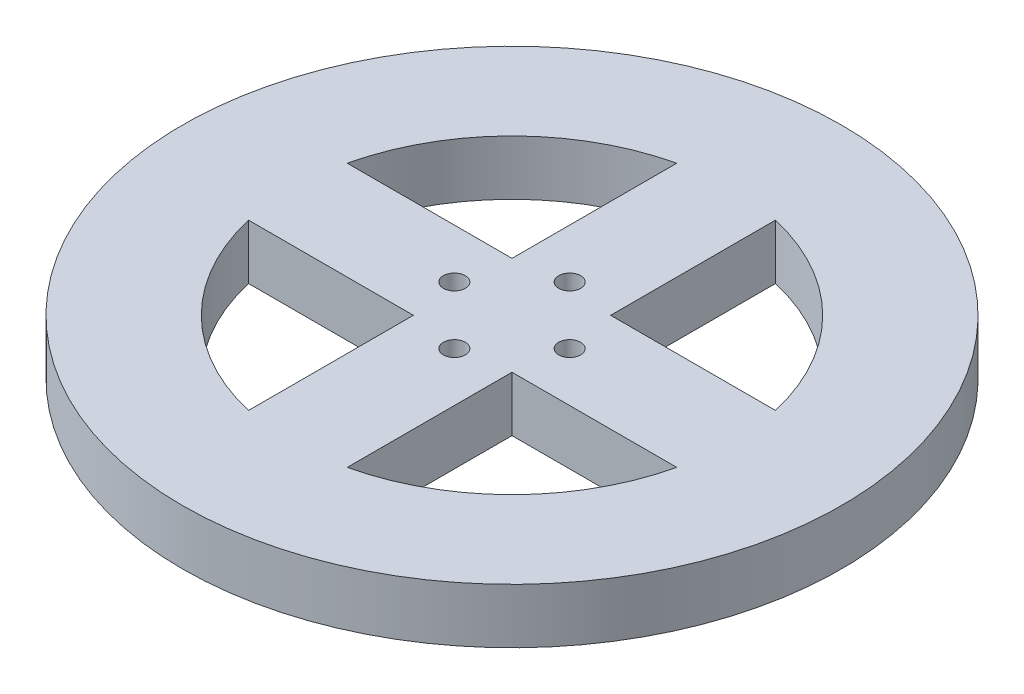
ISO-10303-21;
HEADER;
FILE_DESCRIPTION(('STEP AP214'),'2;1');
FILE_NAME('part.step','',(''),(''),'','','');
FILE_SCHEMA(('AUTOMOTIVE_DESIGN { 1 0 10303 214 1 1 1 1 }'));
ENDSEC;
DATA;
#1=APPLICATION_CONTEXT('core data for automotive mechanical design processes');
#2=APPLICATION_PROTOCOL_DEFINITION('international standard','automotive_design',2000,#1);
#3=PRODUCT_CONTEXT('',#1,'mechanical');
#4=PRODUCT('Part','Part','',(#3));
#5=PRODUCT_RELATED_PRODUCT_CATEGORY('part','',(#4));
#6=PRODUCT_DEFINITION_FORMATION('','',#4);
#7=PRODUCT_DEFINITION_CONTEXT('part definition',#1,'design');
#8=PRODUCT_DEFINITION('design','',#6,#7);
#9=PRODUCT_DEFINITION_SHAPE('','',#8);
#10=(LENGTH_UNIT() NAMED_UNIT(*) SI_UNIT(.MILLI.,.METRE.));
#11=(NAMED_UNIT(*) PLANE_ANGLE_UNIT() SI_UNIT($,.RADIAN.));
#12=(NAMED_UNIT(*) SI_UNIT($,.STERADIAN.) SOLID_ANGLE_UNIT());
#13=UNCERTAINTY_MEASURE_WITH_UNIT(LENGTH_MEASURE(1.E-05),#10,'distance_accuracy_value','');
#14=(GEOMETRIC_REPRESENTATION_CONTEXT(3) GLOBAL_UNCERTAINTY_ASSIGNED_CONTEXT((#13)) GLOBAL_UNIT_ASSIGNED_CONTEXT((#10,
#11,#12)) REPRESENTATION_CONTEXT('',''));
#15=CARTESIAN_POINT('',(0.,0.,0.));
#16=DIRECTION('',(0.,0.,1.));
#17=DIRECTION('',(1.,0.,0.));
#18=AXIS2_PLACEMENT_3D('',#15,#16,#17);
#19=CARTESIAN_POINT('',(0.,10.,0.));
#20=DIRECTION('',(0.,1.,0.));
#21=DIRECTION('',(0.,0.,1.));
#22=AXIS2_PLACEMENT_3D('',#19,#20,#21);
#23=PLANE('',#22);
#24=CARTESIAN_POINT('',(-10.5,10.,0.));
#25=DIRECTION('',(0.,-1.,0.));
#26=DIRECTION('',(0.,0.,-1.));
#27=AXIS2_PLACEMENT_3D('',#24,#25,#26);
#28=CIRCLE('',#27,2.);
#29=CARTESIAN_POINT('',(-10.5,10.,-2.));
#30=VERTEX_POINT('',#29);
#31=EDGE_CURVE('E157',#30,#30,#28,.T.);
#32=ORIENTED_EDGE('',*,*,#31,.T.);
#33=EDGE_LOOP('',(#32));
#34=FACE_BOUND('',#33,.T.);
#35=CARTESIAN_POINT('',(0.,10.,10.5));
#36=DIRECTION('',(0.,-1.,0.));
#37=DIRECTION('',(0.,0.,-1.));
#38=AXIS2_PLACEMENT_3D('',#35,#36,#37);
#39=CIRCLE('',#38,2.);
#40=CARTESIAN_POINT('',(0.,10.,8.5));
#41=VERTEX_POINT('',#40);
#42=EDGE_CURVE('E401',#41,#41,#39,.T.);
#43=ORIENTED_EDGE('',*,*,#42,.T.);
#44=EDGE_LOOP('',(#43));
#45=FACE_BOUND('',#44,.T.);
#46=CARTESIAN_POINT('',(10.5,10.,0.));
#47=DIRECTION('',(0.,-1.,0.));
#48=DIRECTION('',(0.,0.,-1.));
#49=AXIS2_PLACEMENT_3D('',#46,#47,#48);
#50=CIRCLE('',#49,2.);
#51=CARTESIAN_POINT('',(10.5,10.,-2.00000000000007));
#52=VERTEX_POINT('',#51);
#53=EDGE_CURVE('E413',#52,#52,#50,.T.);
#54=ORIENTED_EDGE('',*,*,#53,.T.);
#55=EDGE_LOOP('',(#54));
#56=FACE_BOUND('',#55,.T.);
#57=CARTESIAN_POINT('',(-1.10430506510431E-13,10.,-10.5));
#58=DIRECTION('',(0.,-1.,0.));
#59=DIRECTION('',(0.,0.,-1.));
#60=AXIS2_PLACEMENT_3D('',#57,#58,#59);
#61=CIRCLE('',#60,2.);
#62=CARTESIAN_POINT('',(-1.10430506510431E-13,10.,-12.5));
#63=VERTEX_POINT('',#62);
#64=EDGE_CURVE('E421',#63,#63,#61,.T.);
#65=ORIENTED_EDGE('',*,*,#64,.T.);
#66=EDGE_LOOP('',(#65));
#67=FACE_BOUND('',#66,.T.);
#68=CARTESIAN_POINT('',(0.,10.,0.));
#69=DIRECTION('',(0.,1.,0.));
#70=DIRECTION('',(0.,0.,1.));
#71=AXIS2_PLACEMENT_3D('',#68,#69,#70);
#72=CIRCLE('',#71,60.);
#73=CARTESIAN_POINT('',(0.,10.,60.));
#74=VERTEX_POINT('',#73);
#75=EDGE_CURVE('E11',#74,#74,#72,.T.);
#76=ORIENTED_EDGE('',*,*,#75,.T.);
#77=EDGE_LOOP('',(#76));
#78=FACE_BOUND('',#77,.T.);
#79=DIRECTION('',(0.,0.,-1.));
#80=VECTOR('',#79,1.);
#81=CARTESIAN_POINT('',(-8.9791576165636,10.,38.9791576165636));
#82=LINE('',#81,#80);
#83=CARTESIAN_POINT('',(-8.9791576165636,10.,38.9791576165636));
#84=VERTEX_POINT('',#83);
#85=CARTESIAN_POINT('',(-8.9791576165636,10.,8.9791576165636));
#86=VERTEX_POINT('',#85);
#87=EDGE_CURVE('E236',#84,#86,#82,.T.);
#88=ORIENTED_EDGE('',*,*,#87,.F.);
#89=CARTESIAN_POINT('',(0.,10.,0.));
#90=DIRECTION('',(0.,1.,0.));
#91=DIRECTION('',(0.,0.,1.));
#92=AXIS2_PLACEMENT_3D('',#89,#90,#91);
#93=CIRCLE('',#92,40.);
#94=CARTESIAN_POINT('',(-38.9791576165636,10.,8.9791576165636));
#95=VERTEX_POINT('',#94);
#96=EDGE_CURVE('E233',#95,#84,#93,.T.);
#97=ORIENTED_EDGE('',*,*,#96,.F.);
#98=DIRECTION('',(-1.,0.,0.));
#99=VECTOR('',#98,1.);
#100=CARTESIAN_POINT('',(-8.9791576165636,10.,8.9791576165636));
#101=LINE('',#100,#99);
#102=EDGE_CURVE('E241',#86,#95,#101,.T.);
#103=ORIENTED_EDGE('',*,*,#102,.F.);
#104=EDGE_LOOP('',(#88,#97,#103));
#105=FACE_BOUND('',#104,.T.);
#106=DIRECTION('',(1.,0.,0.));
#107=VECTOR('',#106,1.);
#108=CARTESIAN_POINT('',(-38.9791576165636,10.,-8.97915761656359));
#109=LINE('',#108,#107);
#110=CARTESIAN_POINT('',(-38.9791576165636,10.,-8.97915761656359));
#111=VERTEX_POINT('',#110);
#112=CARTESIAN_POINT('',(-8.97915761656359,10.,-8.97915761656359));
#113=VERTEX_POINT('',#112);
#114=EDGE_CURVE('E203',#111,#113,#109,.T.);
#115=ORIENTED_EDGE('',*,*,#114,.F.);
#116=CARTESIAN_POINT('',(0.,10.,0.));
#117=DIRECTION('',(0.,1.,0.));
#118=DIRECTION('',(0.,0.,1.));
#119=AXIS2_PLACEMENT_3D('',#116,#117,#118);
#120=CIRCLE('',#119,40.);
#121=CARTESIAN_POINT('',(-8.97915761656359,10.,-38.9791576165636));
#122=VERTEX_POINT('',#121);
#123=EDGE_CURVE('E200',#122,#111,#120,.T.);
#124=ORIENTED_EDGE('',*,*,#123,.F.);
#125=DIRECTION('',(0.,0.,-1.));
#126=VECTOR('',#125,1.);
#127=CARTESIAN_POINT('',(-8.97915761656359,10.,-8.97915761656359));
#128=LINE('',#127,#126);
#129=EDGE_CURVE('E208',#113,#122,#128,.T.);
#130=ORIENTED_EDGE('',*,*,#129,.F.);
#131=EDGE_LOOP('',(#115,#124,#130));
#132=FACE_BOUND('',#131,.T.);
#133=DIRECTION('',(0.,0.,1.));
#134=VECTOR('',#133,1.);
#135=CARTESIAN_POINT('',(8.97915761656359,10.,-38.9791576165636));
#136=LINE('',#135,#134);
#137=CARTESIAN_POINT('',(8.97915761656359,10.,-38.9791576165636));
#138=VERTEX_POINT('',#137);
#139=CARTESIAN_POINT('',(8.97915761656359,10.,-8.97915761656359));
#140=VERTEX_POINT('',#139);
#141=EDGE_CURVE('E170',#138,#140,#136,.T.);
#142=ORIENTED_EDGE('',*,*,#141,.F.);
#143=CARTESIAN_POINT('',(0.,10.,0.));
#144=DIRECTION('',(0.,1.,0.));
#145=DIRECTION('',(0.,0.,1.));
#146=AXIS2_PLACEMENT_3D('',#143,#144,#145);
#147=CIRCLE('',#146,40.);
#148=CARTESIAN_POINT('',(38.9791576165636,10.,-8.9791576165636));
#149=VERTEX_POINT('',#148);
#150=EDGE_CURVE('E167',#149,#138,#147,.T.);
#151=ORIENTED_EDGE('',*,*,#150,.F.);
#152=DIRECTION('',(1.,0.,0.));
#153=VECTOR('',#152,1.);
#154=CARTESIAN_POINT('',(8.97915761656359,10.,-8.97915761656359));
#155=LINE('',#154,#153);
#156=EDGE_CURVE('E175',#140,#149,#155,.T.);
#157=ORIENTED_EDGE('',*,*,#156,.F.);
#158=EDGE_LOOP('',(#142,#151,#157));
#159=FACE_BOUND('',#158,.T.);
#160=DIRECTION('',(-1.,0.,0.));
#161=VECTOR('',#160,1.);
#162=CARTESIAN_POINT('',(38.9791576165636,10.,8.97915761656359));
#163=LINE('',#162,#161);
#164=CARTESIAN_POINT('',(38.9791576165636,10.,8.97915761656359));
#165=VERTEX_POINT('',#164);
#166=CARTESIAN_POINT('',(8.9791576165636,10.,8.97915761656359));
#167=VERTEX_POINT('',#166);
#168=EDGE_CURVE('E138',#165,#167,#163,.T.);
#169=ORIENTED_EDGE('',*,*,#168,.F.);
#170=CARTESIAN_POINT('',(0.,10.,0.));
#171=DIRECTION('',(0.,1.,0.));
#172=DIRECTION('',(0.,0.,1.));
#173=AXIS2_PLACEMENT_3D('',#170,#171,#172);
#174=CIRCLE('',#173,40.);
#175=CARTESIAN_POINT('',(8.9791576165636,10.,38.9791576165636));
#176=VERTEX_POINT('',#175);
#177=EDGE_CURVE('E129',#176,#165,#174,.T.);
#178=ORIENTED_EDGE('',*,*,#177,.F.);
#179=DIRECTION('',(0.,0.,1.));
#180=VECTOR('',#179,1.);
#181=CARTESIAN_POINT('',(8.9791576165636,10.,8.97915761656359));
#182=LINE('',#181,#180);
#183=EDGE_CURVE('E148',#167,#176,#182,.T.);
#184=ORIENTED_EDGE('',*,*,#183,.F.);
#185=EDGE_LOOP('',(#169,#178,#184));
#186=FACE_BOUND('',#185,.T.);
#187=ADVANCED_FACE('F39',(#34,#45,#56,#67,#78,#105,#132,#159,#186),#23,.T.);
#188=CARTESIAN_POINT('',(0.,0.,0.));
#189=DIRECTION('',(0.,1.,0.));
#190=DIRECTION('',(0.,0.,1.));
#191=AXIS2_PLACEMENT_3D('',#188,#189,#190);
#192=PLANE('',#191);
#193=CARTESIAN_POINT('',(-10.5,0.,0.));
#194=DIRECTION('',(0.,-1.,0.));
#195=DIRECTION('',(0.,0.,-1.));
#196=AXIS2_PLACEMENT_3D('',#193,#194,#195);
#197=CIRCLE('',#196,2.);
#198=CARTESIAN_POINT('',(-10.5,0.,-2.));
#199=VERTEX_POINT('',#198);
#200=EDGE_CURVE('E399',#199,#199,#197,.T.);
#201=ORIENTED_EDGE('',*,*,#200,.F.);
#202=EDGE_LOOP('',(#201));
#203=FACE_BOUND('',#202,.T.);
#204=CARTESIAN_POINT('',(0.,0.,10.5));
#205=DIRECTION('',(0.,-1.,0.));
#206=DIRECTION('',(0.,0.,-1.));
#207=AXIS2_PLACEMENT_3D('',#204,#205,#206);
#208=CIRCLE('',#207,2.);
#209=CARTESIAN_POINT('',(0.,0.,8.5));
#210=VERTEX_POINT('',#209);
#211=EDGE_CURVE('E407',#210,#210,#208,.T.);
#212=ORIENTED_EDGE('',*,*,#211,.F.);
#213=EDGE_LOOP('',(#212));
#214=FACE_BOUND('',#213,.T.);
#215=CARTESIAN_POINT('',(10.5,0.,0.));
#216=DIRECTION('',(0.,-1.,0.));
#217=DIRECTION('',(0.,0.,-1.));
#218=AXIS2_PLACEMENT_3D('',#215,#216,#217);
#219=CIRCLE('',#218,2.);
#220=CARTESIAN_POINT('',(10.5,0.,-2.00000000000007));
#221=VERTEX_POINT('',#220);
#222=EDGE_CURVE('E417',#221,#221,#219,.T.);
#223=ORIENTED_EDGE('',*,*,#222,.F.);
#224=EDGE_LOOP('',(#223));
#225=FACE_BOUND('',#224,.T.);
#226=CARTESIAN_POINT('',(-1.10430506510431E-13,0.,-10.5));
#227=DIRECTION('',(0.,-1.,0.));
#228=DIRECTION('',(0.,0.,-1.));
#229=AXIS2_PLACEMENT_3D('',#226,#227,#228);
#230=CIRCLE('',#229,2.);
#231=CARTESIAN_POINT('',(-1.10430506510431E-13,0.,-12.5));
#232=VERTEX_POINT('',#231);
#233=EDGE_CURVE('E424',#232,#232,#230,.T.);
#234=ORIENTED_EDGE('',*,*,#233,.F.);
#235=EDGE_LOOP('',(#234));
#236=FACE_BOUND('',#235,.T.);
#237=CARTESIAN_POINT('',(0.,0.,0.));
#238=DIRECTION('',(0.,1.,0.));
#239=DIRECTION('',(0.,0.,1.));
#240=AXIS2_PLACEMENT_3D('',#237,#238,#239);
#241=CIRCLE('',#240,40.);
#242=CARTESIAN_POINT('',(38.9791576165636,0.,-8.9791576165636));
#243=VERTEX_POINT('',#242);
#244=CARTESIAN_POINT('',(8.97915761656359,0.,-38.9791576165636));
#245=VERTEX_POINT('',#244);
#246=EDGE_CURVE('E146',#243,#245,#241,.T.);
#247=ORIENTED_EDGE('',*,*,#246,.T.);
#248=DIRECTION('',(0.,0.,1.));
#249=VECTOR('',#248,1.);
#250=CARTESIAN_POINT('',(8.97915761656359,0.,-38.9791576165636));
#251=LINE('',#250,#249);
#252=CARTESIAN_POINT('',(8.97915761656359,0.,-8.97915761656359));
#253=VERTEX_POINT('',#252);
#254=EDGE_CURVE('E182',#245,#253,#251,.T.);
#255=ORIENTED_EDGE('',*,*,#254,.T.);
#256=DIRECTION('',(1.,0.,0.));
#257=VECTOR('',#256,1.);
#258=CARTESIAN_POINT('',(8.97915761656359,0.,-8.97915761656359));
#259=LINE('',#258,#257);
#260=EDGE_CURVE('E171',#253,#243,#259,.T.);
#261=ORIENTED_EDGE('',*,*,#260,.T.);
#262=EDGE_LOOP('',(#247,#255,#261));
#263=FACE_BOUND('',#262,.T.);
#264=CARTESIAN_POINT('',(0.,0.,0.));
#265=DIRECTION('',(0.,1.,0.));
#266=DIRECTION('',(0.,0.,1.));
#267=AXIS2_PLACEMENT_3D('',#264,#265,#266);
#268=CIRCLE('',#267,40.);
#269=CARTESIAN_POINT('',(-38.9791576165636,0.,8.9791576165636));
#270=VERTEX_POINT('',#269);
#271=CARTESIAN_POINT('',(-8.9791576165636,0.,38.9791576165636));
#272=VERTEX_POINT('',#271);
#273=EDGE_CURVE('E232',#270,#272,#268,.T.);
#274=ORIENTED_EDGE('',*,*,#273,.T.);
#275=DIRECTION('',(0.,0.,-1.));
#276=VECTOR('',#275,1.);
#277=CARTESIAN_POINT('',(-8.9791576165636,0.,38.9791576165636));
#278=LINE('',#277,#276);
#279=CARTESIAN_POINT('',(-8.9791576165636,0.,8.9791576165636));
#280=VERTEX_POINT('',#279);
#281=EDGE_CURVE('E248',#272,#280,#278,.T.);
#282=ORIENTED_EDGE('',*,*,#281,.T.);
#283=DIRECTION('',(-1.,0.,0.));
#284=VECTOR('',#283,1.);
#285=CARTESIAN_POINT('',(-8.9791576165636,0.,8.9791576165636));
#286=LINE('',#285,#284);
#287=EDGE_CURVE('E237',#280,#270,#286,.T.);
#288=ORIENTED_EDGE('',*,*,#287,.T.);
#289=EDGE_LOOP('',(#274,#282,#288));
#290=FACE_BOUND('',#289,.T.);
#291=CARTESIAN_POINT('',(0.,0.,0.));
#292=DIRECTION('',(0.,1.,0.));
#293=DIRECTION('',(0.,0.,1.));
#294=AXIS2_PLACEMENT_3D('',#291,#292,#293);
#295=CIRCLE('',#294,60.);
#296=CARTESIAN_POINT('',(0.,0.,60.));
#297=VERTEX_POINT('',#296);
#298=EDGE_CURVE('E43',#297,#297,#295,.T.);
#299=ORIENTED_EDGE('',*,*,#298,.F.);
#300=EDGE_LOOP('',(#299));
#301=FACE_BOUND('',#300,.T.);
#302=CARTESIAN_POINT('',(0.,0.,0.));
#303=DIRECTION('',(0.,1.,0.));
#304=DIRECTION('',(0.,0.,1.));
#305=AXIS2_PLACEMENT_3D('',#302,#303,#304);
#306=CIRCLE('',#305,40.);
#307=CARTESIAN_POINT('',(-8.97915761656359,0.,-38.9791576165636));
#308=VERTEX_POINT('',#307);
#309=CARTESIAN_POINT('',(-38.9791576165636,0.,-8.97915761656359));
#310=VERTEX_POINT('',#309);
#311=EDGE_CURVE('E199',#308,#310,#306,.T.);
#312=ORIENTED_EDGE('',*,*,#311,.T.);
#313=DIRECTION('',(1.,0.,0.));
#314=VECTOR('',#313,1.);
#315=CARTESIAN_POINT('',(-38.9791576165636,0.,-8.97915761656359));
#316=LINE('',#315,#314);
#317=CARTESIAN_POINT('',(-8.97915761656359,0.,-8.97915761656359));
#318=VERTEX_POINT('',#317);
#319=EDGE_CURVE('E215',#310,#318,#316,.T.);
#320=ORIENTED_EDGE('',*,*,#319,.T.);
#321=DIRECTION('',(0.,0.,-1.));
#322=VECTOR('',#321,1.);
#323=CARTESIAN_POINT('',(-8.97915761656359,0.,-8.97915761656359));
#324=LINE('',#323,#322);
#325=EDGE_CURVE('E204',#318,#308,#324,.T.);
#326=ORIENTED_EDGE('',*,*,#325,.T.);
#327=EDGE_LOOP('',(#312,#320,#326));
#328=FACE_BOUND('',#327,.T.);
#329=CARTESIAN_POINT('',(0.,0.,0.));
#330=DIRECTION('',(0.,1.,0.));
#331=DIRECTION('',(0.,0.,1.));
#332=AXIS2_PLACEMENT_3D('',#329,#330,#331);
#333=CIRCLE('',#332,40.);
#334=CARTESIAN_POINT('',(8.9791576165636,0.,38.9791576165636));
#335=VERTEX_POINT('',#334);
#336=CARTESIAN_POINT('',(38.9791576165636,0.,8.97915761656359));
#337=VERTEX_POINT('',#336);
#338=EDGE_CURVE('E63',#335,#337,#333,.T.);
#339=ORIENTED_EDGE('',*,*,#338,.T.);
#340=DIRECTION('',(-1.,0.,0.));
#341=VECTOR('',#340,1.);
#342=CARTESIAN_POINT('',(38.9791576165636,0.,8.97915761656359));
#343=LINE('',#342,#341);
#344=CARTESIAN_POINT('',(8.9791576165636,0.,8.97915761656359));
#345=VERTEX_POINT('',#344);
#346=EDGE_CURVE('E144',#337,#345,#343,.T.);
#347=ORIENTED_EDGE('',*,*,#346,.T.);
#348=DIRECTION('',(0.,0.,1.));
#349=VECTOR('',#348,1.);
#350=CARTESIAN_POINT('',(8.9791576165636,0.,8.97915761656359));
#351=LINE('',#350,#349);
#352=EDGE_CURVE('E139',#345,#335,#351,.T.);
#353=ORIENTED_EDGE('',*,*,#352,.T.);
#354=EDGE_LOOP('',(#339,#347,#353));
#355=FACE_BOUND('',#354,.T.);
#356=ADVANCED_FACE('F271',(#203,#214,#225,#236,#263,#290,#301,#328,#355),#192,.F.);
#357=CARTESIAN_POINT('',(0.,10.,0.));
#358=DIRECTION('',(0.,-1.,0.));
#359=DIRECTION('',(0.,0.,-1.));
#360=AXIS2_PLACEMENT_3D('',#357,#358,#359);
#361=CYLINDRICAL_SURFACE('',#360,60.);
#362=ORIENTED_EDGE('',*,*,#75,.F.);
#363=EDGE_LOOP('',(#362));
#364=FACE_BOUND('',#363,.T.);
#365=ORIENTED_EDGE('',*,*,#298,.T.);
#366=EDGE_LOOP('',(#365));
#367=FACE_BOUND('',#366,.T.);
#368=ADVANCED_FACE('F41',(#364,#367),#361,.T.);
#369=CARTESIAN_POINT('',(0.,10.,0.));
#370=DIRECTION('',(0.,-1.,0.));
#371=DIRECTION('',(0.,0.,-1.));
#372=AXIS2_PLACEMENT_3D('',#369,#370,#371);
#373=CYLINDRICAL_SURFACE('',#372,40.);
#374=ORIENTED_EDGE('',*,*,#273,.F.);
#375=DIRECTION('',(0.,-1.,0.));
#376=VECTOR('',#375,1.);
#377=CARTESIAN_POINT('',(-38.9791576165636,10.,8.9791576165636));
#378=LINE('',#377,#376);
#379=EDGE_CURVE('E244',#95,#270,#378,.T.);
#380=ORIENTED_EDGE('',*,*,#379,.F.);
#381=ORIENTED_EDGE('',*,*,#96,.T.);
#382=DIRECTION('',(0.,-1.,0.));
#383=VECTOR('',#382,1.);
#384=CARTESIAN_POINT('',(-8.9791576165636,10.,38.9791576165636));
#385=LINE('',#384,#383);
#386=EDGE_CURVE('E261',#84,#272,#385,.T.);
#387=ORIENTED_EDGE('',*,*,#386,.T.);
#388=EDGE_LOOP('',(#374,#380,#381,#387));
#389=FACE_BOUND('',#388,.T.);
#390=ADVANCED_FACE('F296',(#389),#373,.F.);
#391=CARTESIAN_POINT('',(-8.9791576165636,10.,38.9791576165636));
#392=DIRECTION('',(-1.,0.,0.));
#393=DIRECTION('',(0.,0.,1.));
#394=AXIS2_PLACEMENT_3D('',#391,#392,#393);
#395=PLANE('',#394);
#396=ORIENTED_EDGE('',*,*,#281,.F.);
#397=ORIENTED_EDGE('',*,*,#386,.F.);
#398=ORIENTED_EDGE('',*,*,#87,.T.);
#399=DIRECTION('',(0.,-1.,0.));
#400=VECTOR('',#399,1.);
#401=CARTESIAN_POINT('',(-8.9791576165636,10.,8.9791576165636));
#402=LINE('',#401,#400);
#403=EDGE_CURVE('E258',#86,#280,#402,.T.);
#404=ORIENTED_EDGE('',*,*,#403,.T.);
#405=EDGE_LOOP('',(#396,#397,#398,#404));
#406=FACE_BOUND('',#405,.T.);
#407=ADVANCED_FACE('F299',(#406),#395,.T.);
#408=CARTESIAN_POINT('',(-8.9791576165636,10.,8.9791576165636));
#409=DIRECTION('',(0.,0.,1.));
#410=DIRECTION('',(1.,0.,0.));
#411=AXIS2_PLACEMENT_3D('',#408,#409,#410);
#412=PLANE('',#411);
#413=ORIENTED_EDGE('',*,*,#287,.F.);
#414=ORIENTED_EDGE('',*,*,#403,.F.);
#415=ORIENTED_EDGE('',*,*,#102,.T.);
#416=ORIENTED_EDGE('',*,*,#379,.T.);
#417=EDGE_LOOP('',(#413,#414,#415,#416));
#418=FACE_BOUND('',#417,.T.);
#419=ADVANCED_FACE('F302',(#418),#412,.T.);
#420=CARTESIAN_POINT('',(0.,10.,0.));
#421=DIRECTION('',(0.,-1.,0.));
#422=DIRECTION('',(0.,0.,-1.));
#423=AXIS2_PLACEMENT_3D('',#420,#421,#422);
#424=CYLINDRICAL_SURFACE('',#423,40.);
#425=ORIENTED_EDGE('',*,*,#311,.F.);
#426=DIRECTION('',(0.,-1.,0.));
#427=VECTOR('',#426,1.);
#428=CARTESIAN_POINT('',(-8.97915761656359,10.,-38.9791576165636));
#429=LINE('',#428,#427);
#430=EDGE_CURVE('E211',#122,#308,#429,.T.);
#431=ORIENTED_EDGE('',*,*,#430,.F.);
#432=ORIENTED_EDGE('',*,*,#123,.T.);
#433=DIRECTION('',(0.,-1.,0.));
#434=VECTOR('',#433,1.);
#435=CARTESIAN_POINT('',(-38.9791576165636,10.,-8.97915761656359));
#436=LINE('',#435,#434);
#437=EDGE_CURVE('E228',#111,#310,#436,.T.);
#438=ORIENTED_EDGE('',*,*,#437,.T.);
#439=EDGE_LOOP('',(#425,#431,#432,#438));
#440=FACE_BOUND('',#439,.T.);
#441=ADVANCED_FACE('F306',(#440),#424,.F.);
#442=CARTESIAN_POINT('',(-38.9791576165636,10.,-8.97915761656359));
#443=DIRECTION('',(0.,0.,-1.));
#444=DIRECTION('',(-1.,0.,0.));
#445=AXIS2_PLACEMENT_3D('',#442,#443,#444);
#446=PLANE('',#445);
#447=ORIENTED_EDGE('',*,*,#319,.F.);
#448=ORIENTED_EDGE('',*,*,#437,.F.);
#449=ORIENTED_EDGE('',*,*,#114,.T.);
#450=DIRECTION('',(0.,-1.,0.));
#451=VECTOR('',#450,1.);
#452=CARTESIAN_POINT('',(-8.97915761656359,10.,-8.97915761656359));
#453=LINE('',#452,#451);
#454=EDGE_CURVE('E225',#113,#318,#453,.T.);
#455=ORIENTED_EDGE('',*,*,#454,.T.);
#456=EDGE_LOOP('',(#447,#448,#449,#455));
#457=FACE_BOUND('',#456,.T.);
#458=ADVANCED_FACE('F310',(#457),#446,.T.);
#459=CARTESIAN_POINT('',(-8.97915761656359,10.,-8.97915761656359));
#460=DIRECTION('',(-1.,0.,0.));
#461=DIRECTION('',(0.,0.,1.));
#462=AXIS2_PLACEMENT_3D('',#459,#460,#461);
#463=PLANE('',#462);
#464=ORIENTED_EDGE('',*,*,#325,.F.);
#465=ORIENTED_EDGE('',*,*,#454,.F.);
#466=ORIENTED_EDGE('',*,*,#129,.T.);
#467=ORIENTED_EDGE('',*,*,#430,.T.);
#468=EDGE_LOOP('',(#464,#465,#466,#467));
#469=FACE_BOUND('',#468,.T.);
#470=ADVANCED_FACE('F314',(#469),#463,.T.);
#471=CARTESIAN_POINT('',(0.,10.,0.));
#472=DIRECTION('',(0.,-1.,0.));
#473=DIRECTION('',(0.,0.,-1.));
#474=AXIS2_PLACEMENT_3D('',#471,#472,#473);
#475=CYLINDRICAL_SURFACE('',#474,40.);
#476=ORIENTED_EDGE('',*,*,#246,.F.);
#477=DIRECTION('',(0.,-1.,0.));
#478=VECTOR('',#477,1.);
#479=CARTESIAN_POINT('',(38.9791576165636,10.,-8.9791576165636));
#480=LINE('',#479,#478);
#481=EDGE_CURVE('E178',#149,#243,#480,.T.);
#482=ORIENTED_EDGE('',*,*,#481,.F.);
#483=ORIENTED_EDGE('',*,*,#150,.T.);
#484=DIRECTION('',(0.,-1.,0.));
#485=VECTOR('',#484,1.);
#486=CARTESIAN_POINT('',(8.97915761656359,10.,-38.9791576165636));
#487=LINE('',#486,#485);
#488=EDGE_CURVE('E195',#138,#245,#487,.T.);
#489=ORIENTED_EDGE('',*,*,#488,.T.);
#490=EDGE_LOOP('',(#476,#482,#483,#489));
#491=FACE_BOUND('',#490,.T.);
#492=ADVANCED_FACE('F318',(#491),#475,.F.);
#493=CARTESIAN_POINT('',(8.97915761656359,10.,-38.9791576165636));
#494=DIRECTION('',(1.,0.,0.));
#495=DIRECTION('',(0.,0.,-1.));
#496=AXIS2_PLACEMENT_3D('',#493,#494,#495);
#497=PLANE('',#496);
#498=ORIENTED_EDGE('',*,*,#254,.F.);
#499=ORIENTED_EDGE('',*,*,#488,.F.);
#500=ORIENTED_EDGE('',*,*,#141,.T.);
#501=DIRECTION('',(0.,-1.,0.));
#502=VECTOR('',#501,1.);
#503=CARTESIAN_POINT('',(8.97915761656359,10.,-8.97915761656359));
#504=LINE('',#503,#502);
#505=EDGE_CURVE('E192',#140,#253,#504,.T.);
#506=ORIENTED_EDGE('',*,*,#505,.T.);
#507=EDGE_LOOP('',(#498,#499,#500,#506));
#508=FACE_BOUND('',#507,.T.);
#509=ADVANCED_FACE('F322',(#508),#497,.T.);
#510=CARTESIAN_POINT('',(8.97915761656359,10.,-8.97915761656359));
#511=DIRECTION('',(0.,0.,-1.));
#512=DIRECTION('',(-1.,0.,0.));
#513=AXIS2_PLACEMENT_3D('',#510,#511,#512);
#514=PLANE('',#513);
#515=ORIENTED_EDGE('',*,*,#260,.F.);
#516=ORIENTED_EDGE('',*,*,#505,.F.);
#517=ORIENTED_EDGE('',*,*,#156,.T.);
#518=ORIENTED_EDGE('',*,*,#481,.T.);
#519=EDGE_LOOP('',(#515,#516,#517,#518));
#520=FACE_BOUND('',#519,.T.);
#521=ADVANCED_FACE('F326',(#520),#514,.T.);
#522=CARTESIAN_POINT('',(0.,10.,0.));
#523=DIRECTION('',(0.,-1.,0.));
#524=DIRECTION('',(0.,0.,-1.));
#525=AXIS2_PLACEMENT_3D('',#522,#523,#524);
#526=CYLINDRICAL_SURFACE('',#525,40.);
#527=ORIENTED_EDGE('',*,*,#338,.F.);
#528=DIRECTION('',(0.,-1.,0.));
#529=VECTOR('',#528,1.);
#530=CARTESIAN_POINT('',(8.9791576165636,10.,38.9791576165636));
#531=LINE('',#530,#529);
#532=EDGE_CURVE('E133',#176,#335,#531,.T.);
#533=ORIENTED_EDGE('',*,*,#532,.F.);
#534=ORIENTED_EDGE('',*,*,#177,.T.);
#535=DIRECTION('',(0.,-1.,0.));
#536=VECTOR('',#535,1.);
#537=CARTESIAN_POINT('',(38.9791576165636,10.,8.97915761656359));
#538=LINE('',#537,#536);
#539=EDGE_CURVE('E132',#165,#337,#538,.T.);
#540=ORIENTED_EDGE('',*,*,#539,.T.);
#541=EDGE_LOOP('',(#527,#533,#534,#540));
#542=FACE_BOUND('',#541,.T.);
#543=ADVANCED_FACE('F131',(#542),#526,.F.);
#544=CARTESIAN_POINT('',(38.9791576165636,10.,8.97915761656359));
#545=DIRECTION('',(0.,0.,1.));
#546=DIRECTION('',(1.,0.,0.));
#547=AXIS2_PLACEMENT_3D('',#544,#545,#546);
#548=PLANE('',#547);
#549=ORIENTED_EDGE('',*,*,#346,.F.);
#550=ORIENTED_EDGE('',*,*,#539,.F.);
#551=ORIENTED_EDGE('',*,*,#168,.T.);
#552=DIRECTION('',(0.,-1.,0.));
#553=VECTOR('',#552,1.);
#554=CARTESIAN_POINT('',(8.9791576165636,10.,8.97915761656359));
#555=LINE('',#554,#553);
#556=EDGE_CURVE('E55',#167,#345,#555,.T.);
#557=ORIENTED_EDGE('',*,*,#556,.T.);
#558=EDGE_LOOP('',(#549,#550,#551,#557));
#559=FACE_BOUND('',#558,.T.);
#560=ADVANCED_FACE('F142',(#559),#548,.T.);
#561=CARTESIAN_POINT('',(8.9791576165636,10.,8.97915761656359));
#562=DIRECTION('',(1.,0.,0.));
#563=DIRECTION('',(0.,0.,-1.));
#564=AXIS2_PLACEMENT_3D('',#561,#562,#563);
#565=PLANE('',#564);
#566=ORIENTED_EDGE('',*,*,#352,.F.);
#567=ORIENTED_EDGE('',*,*,#556,.F.);
#568=ORIENTED_EDGE('',*,*,#183,.T.);
#569=ORIENTED_EDGE('',*,*,#532,.T.);
#570=EDGE_LOOP('',(#566,#567,#568,#569));
#571=FACE_BOUND('',#570,.T.);
#572=ADVANCED_FACE('F276',(#571),#565,.T.);
#573=CARTESIAN_POINT('',(-1.10430506510431E-13,10.,-10.5));
#574=DIRECTION('',(0.,-1.,0.));
#575=DIRECTION('',(0.,0.,-1.));
#576=AXIS2_PLACEMENT_3D('',#573,#574,#575);
#577=CYLINDRICAL_SURFACE('',#576,2.);
#578=ORIENTED_EDGE('',*,*,#64,.F.);
#579=EDGE_LOOP('',(#578));
#580=FACE_BOUND('',#579,.T.);
#581=ORIENTED_EDGE('',*,*,#233,.T.);
#582=EDGE_LOOP('',(#581));
#583=FACE_BOUND('',#582,.T.);
#584=ADVANCED_FACE('F278',(#580,#583),#577,.F.);
#585=CARTESIAN_POINT('',(10.5,10.,0.));
#586=DIRECTION('',(0.,-1.,0.));
#587=DIRECTION('',(0.,0.,-1.));
#588=AXIS2_PLACEMENT_3D('',#585,#586,#587);
#589=CYLINDRICAL_SURFACE('',#588,2.);
#590=ORIENTED_EDGE('',*,*,#53,.F.);
#591=EDGE_LOOP('',(#590));
#592=FACE_BOUND('',#591,.T.);
#593=ORIENTED_EDGE('',*,*,#222,.T.);
#594=EDGE_LOOP('',(#593));
#595=FACE_BOUND('',#594,.T.);
#596=ADVANCED_FACE('F284',(#592,#595),#589,.F.);
#597=CARTESIAN_POINT('',(0.,10.,10.5));
#598=DIRECTION('',(0.,-1.,0.));
#599=DIRECTION('',(0.,0.,-1.));
#600=AXIS2_PLACEMENT_3D('',#597,#598,#599);
#601=CYLINDRICAL_SURFACE('',#600,2.);
#602=ORIENTED_EDGE('',*,*,#42,.F.);
#603=EDGE_LOOP('',(#602));
#604=FACE_BOUND('',#603,.T.);
#605=ORIENTED_EDGE('',*,*,#211,.T.);
#606=EDGE_LOOP('',(#605));
#607=FACE_BOUND('',#606,.T.);
#608=ADVANCED_FACE('F371',(#604,#607),#601,.F.);
#609=CARTESIAN_POINT('',(-10.5,10.,0.));
#610=DIRECTION('',(0.,-1.,0.));
#611=DIRECTION('',(0.,0.,-1.));
#612=AXIS2_PLACEMENT_3D('',#609,#610,#611);
#613=CYLINDRICAL_SURFACE('',#612,2.);
#614=ORIENTED_EDGE('',*,*,#31,.F.);
#615=EDGE_LOOP('',(#614));
#616=FACE_BOUND('',#615,.T.);
#617=ORIENTED_EDGE('',*,*,#200,.T.);
#618=EDGE_LOOP('',(#617));
#619=FACE_BOUND('',#618,.T.);
#620=ADVANCED_FACE('F381',(#616,#619),#613,.F.);
#621=CLOSED_SHELL('',(#187,#356,#368,#390,#407,#419,#441,#458,#470,#492,#509,#521,#543,#560,
#572,#584,#596,#608,#620));
#622=MANIFOLD_SOLID_BREP('B2',#621);
#623=ADVANCED_BREP_SHAPE_REPRESENTATION('',(#18,#622),#14);
#624=SHAPE_DEFINITION_REPRESENTATION(#9,#623);
ENDSEC;
END-ISO-10303-21;
